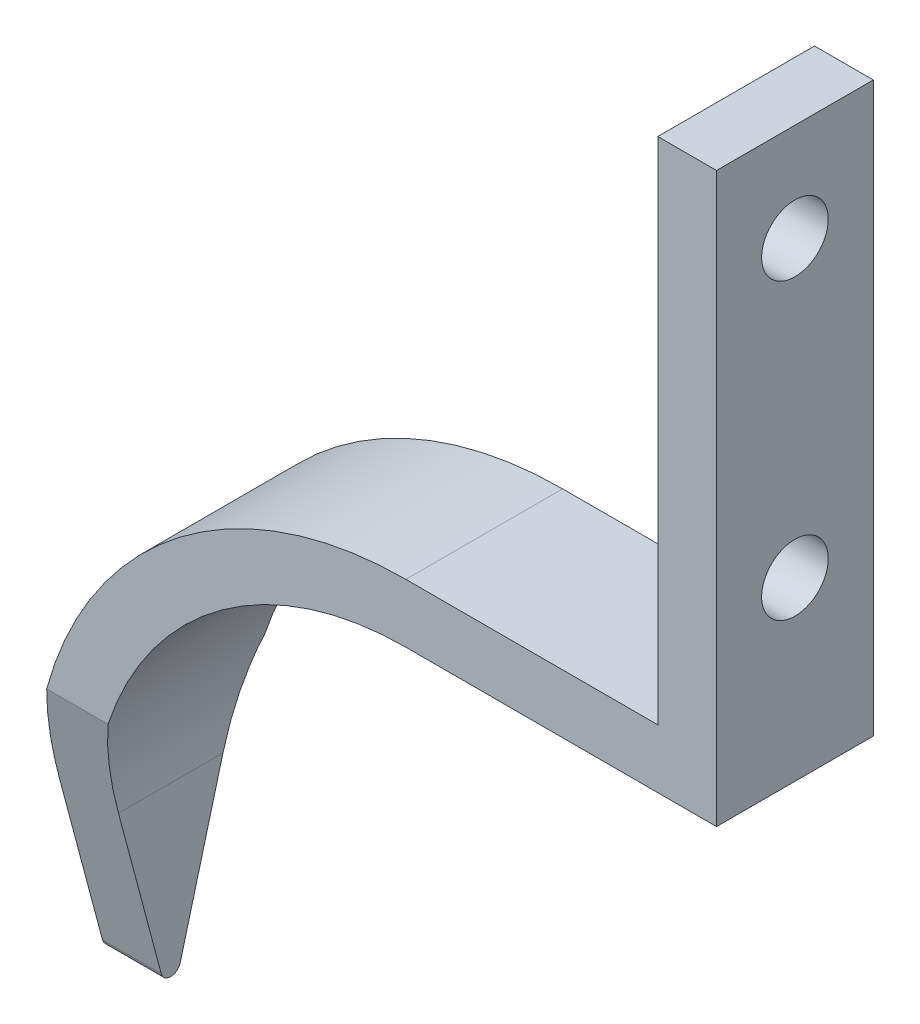
ISO-10303-21;
HEADER;
FILE_DESCRIPTION(('STEP AP214'),'2;1');
FILE_NAME('part.step','',(''),(''),'','','');
FILE_SCHEMA(('AUTOMOTIVE_DESIGN { 1 0 10303 214 1 1 1 1 }'));
ENDSEC;
DATA;
#1=APPLICATION_CONTEXT('core data for automotive mechanical design processes');
#2=APPLICATION_PROTOCOL_DEFINITION('international standard','automotive_design',2000,#1);
#3=PRODUCT_CONTEXT('',#1,'mechanical');
#4=PRODUCT('Part','Part','',(#3));
#5=PRODUCT_RELATED_PRODUCT_CATEGORY('part','',(#4));
#6=PRODUCT_DEFINITION_FORMATION('','',#4);
#7=PRODUCT_DEFINITION_CONTEXT('part definition',#1,'design');
#8=PRODUCT_DEFINITION('design','',#6,#7);
#9=PRODUCT_DEFINITION_SHAPE('','',#8);
#10=(LENGTH_UNIT() NAMED_UNIT(*) SI_UNIT(.MILLI.,.METRE.));
#11=(NAMED_UNIT(*) PLANE_ANGLE_UNIT() SI_UNIT($,.RADIAN.));
#12=(NAMED_UNIT(*) SI_UNIT($,.STERADIAN.) SOLID_ANGLE_UNIT());
#13=UNCERTAINTY_MEASURE_WITH_UNIT(LENGTH_MEASURE(1.E-05),#10,'distance_accuracy_value','');
#14=(GEOMETRIC_REPRESENTATION_CONTEXT(3) GLOBAL_UNCERTAINTY_ASSIGNED_CONTEXT((#13)) GLOBAL_UNIT_ASSIGNED_CONTEXT((#10,
#11,#12)) REPRESENTATION_CONTEXT('',''));
#15=CARTESIAN_POINT('',(0.,0.,0.));
#16=DIRECTION('',(0.,0.,1.));
#17=DIRECTION('',(1.,0.,0.));
#18=AXIS2_PLACEMENT_3D('',#15,#16,#17);
#19=CARTESIAN_POINT('',(-59.,0.,4.00000000000001));
#20=DIRECTION('',(1.,0.,0.));
#21=DIRECTION('',(0.,0.,1.));
#22=AXIS2_PLACEMENT_3D('',#19,#20,#21);
#23=PLANE('',#22);
#24=DIRECTION('',(0.,0.966234939601246,0.257662650560332));
#25=VECTOR('',#24,1.);
#26=CARTESIAN_POINT('',(-59.,2.98755186721991,-11.2033195020747));
#27=LINE('',#26,#25);
#28=CARTESIAN_POINT('',(-59.,46.8116905117523,0.483117469800625));
#29=VERTEX_POINT('',#28);
#30=CARTESIAN_POINT('',(-59.,55.,2.66666666666667));
#31=VERTEX_POINT('',#30);
#32=EDGE_CURVE('E145',#29,#31,#27,.T.);
#33=ORIENTED_EDGE('',*,*,#32,.T.);
#34=DIRECTION('',(0.,0.,-1.));
#35=VECTOR('',#34,1.);
#36=CARTESIAN_POINT('',(-59.,55.,4.));
#37=LINE('',#36,#35);
#38=CARTESIAN_POINT('',(-59.,55.,-2.66666666666666));
#39=VERTEX_POINT('',#38);
#40=EDGE_CURVE('E140',#31,#39,#37,.T.);
#41=ORIENTED_EDGE('',*,*,#40,.T.);
#42=DIRECTION('',(0.,-0.966234939601246,0.257662650560332));
#43=VECTOR('',#42,1.);
#44=CARTESIAN_POINT('',(-59.,2.98755186721991,11.2033195020747));
#45=LINE('',#44,#43);
#46=CARTESIAN_POINT('',(-59.,46.8116905117523,-0.48311746980061));
#47=VERTEX_POINT('',#46);
#48=EDGE_CURVE('E149',#39,#47,#45,.T.);
#49=ORIENTED_EDGE('',*,*,#48,.T.);
#50=CARTESIAN_POINT('',(-59.,46.9405218370325,0.));
#51=DIRECTION('',(-1.,0.,0.));
#52=DIRECTION('',(0.,0.,1.));
#53=AXIS2_PLACEMENT_3D('',#50,#51,#52);
#54=CIRCLE('',#53,0.5);
#55=EDGE_CURVE('E169',#29,#47,#54,.F.);
#56=ORIENTED_EDGE('',*,*,#55,.F.);
#57=EDGE_LOOP('',(#33,#41,#49,#56));
#58=FACE_BOUND('',#57,.T.);
#59=ADVANCED_FACE('F43',(#58),#23,.F.);
#60=CARTESIAN_POINT('',(-40.,55.,4.));
#61=DIRECTION('',(0.,0.,-1.));
#62=DIRECTION('',(1.,0.,0.));
#63=AXIS2_PLACEMENT_3D('',#60,#61,#62);
#64=CYLINDRICAL_SURFACE('',#63,19.);
#65=ORIENTED_EDGE('',*,*,#40,.F.);
#66=CARTESIAN_POINT('',(-40.,55.,2.66666666666667));
#67=DIRECTION('',(0.,-0.257662650560332,0.966234939601246));
#68=DIRECTION('',(0.,-0.966234939601247,-0.257662650560332));
#69=AXIS2_PLACEMENT_3D('',#66,#67,#68);
#70=ELLIPSE('',#69,19.6639546152627,19.);
#71=CARTESIAN_POINT('',(-58.3303027798234,60.,4.));
#72=VERTEX_POINT('',#71);
#73=EDGE_CURVE('E187',#72,#31,#70,.T.);
#74=ORIENTED_EDGE('',*,*,#73,.F.);
#75=CARTESIAN_POINT('',(-40.,55.,4.));
#76=DIRECTION('',(0.,0.,-1.));
#77=DIRECTION('',(-1.,0.,0.));
#78=AXIS2_PLACEMENT_3D('',#75,#76,#77);
#79=CIRCLE('',#78,19.);
#80=CARTESIAN_POINT('',(-40.,74.,4.));
#81=VERTEX_POINT('',#80);
#82=EDGE_CURVE('E216',#72,#81,#79,.T.);
#83=ORIENTED_EDGE('',*,*,#82,.T.);
#84=DIRECTION('',(0.,0.,-1.));
#85=VECTOR('',#84,1.);
#86=CARTESIAN_POINT('',(-40.,74.,4.));
#87=LINE('',#86,#85);
#88=CARTESIAN_POINT('',(-40.,74.,-4.));
#89=VERTEX_POINT('',#88);
#90=EDGE_CURVE('E158',#81,#89,#87,.T.);
#91=ORIENTED_EDGE('',*,*,#90,.T.);
#92=CARTESIAN_POINT('',(-40.,55.,-4.));
#93=DIRECTION('',(0.,0.,-1.));
#94=DIRECTION('',(-1.,0.,0.));
#95=AXIS2_PLACEMENT_3D('',#92,#93,#94);
#96=CIRCLE('',#95,19.);
#97=CARTESIAN_POINT('',(-58.3303027798234,60.,-4.));
#98=VERTEX_POINT('',#97);
#99=EDGE_CURVE('E144',#98,#89,#96,.T.);
#100=ORIENTED_EDGE('',*,*,#99,.F.);
#101=CARTESIAN_POINT('',(-40.,55.,-2.66666666666666));
#102=DIRECTION('',(0.,-0.257662650560332,-0.966234939601246));
#103=DIRECTION('',(0.,0.966234939601247,-0.257662650560332));
#104=AXIS2_PLACEMENT_3D('',#101,#102,#103);
#105=ELLIPSE('',#104,19.6639546152627,19.);
#106=EDGE_CURVE('E136',#39,#98,#105,.T.);
#107=ORIENTED_EDGE('',*,*,#106,.F.);
#108=EDGE_LOOP('',(#65,#74,#83,#91,#100,#107));
#109=FACE_BOUND('',#108,.T.);
#110=ADVANCED_FACE('F137',(#109),#64,.T.);
#111=CARTESIAN_POINT('',(0.,74.,4.));
#112=DIRECTION('',(0.,-1.,0.));
#113=DIRECTION('',(1.,0.,0.));
#114=AXIS2_PLACEMENT_3D('',#111,#112,#113);
#115=PLANE('',#114);
#116=DIRECTION('',(1.,0.,0.));
#117=VECTOR('',#116,1.);
#118=CARTESIAN_POINT('',(0.,74.,-4.));
#119=LINE('',#118,#117);
#120=CARTESIAN_POINT('',(-27.145,74.,-4.));
#121=VERTEX_POINT('',#120);
#122=EDGE_CURVE('E200',#89,#121,#119,.T.);
#123=ORIENTED_EDGE('',*,*,#122,.F.);
#124=ORIENTED_EDGE('',*,*,#90,.F.);
#125=DIRECTION('',(1.,0.,0.));
#126=VECTOR('',#125,1.);
#127=CARTESIAN_POINT('',(0.,74.,4.));
#128=LINE('',#127,#126);
#129=CARTESIAN_POINT('',(-27.145,74.,4.));
#130=VERTEX_POINT('',#129);
#131=EDGE_CURVE('E234',#81,#130,#128,.T.);
#132=ORIENTED_EDGE('',*,*,#131,.T.);
#133=DIRECTION('',(0.,0.,-1.));
#134=VECTOR('',#133,1.);
#135=CARTESIAN_POINT('',(-27.145,74.,4.));
#136=LINE('',#135,#134);
#137=EDGE_CURVE('E163',#130,#121,#136,.T.);
#138=ORIENTED_EDGE('',*,*,#137,.T.);
#139=EDGE_LOOP('',(#123,#124,#132,#138));
#140=FACE_BOUND('',#139,.T.);
#141=ADVANCED_FACE('F232',(#140),#115,.F.);
#142=CARTESIAN_POINT('',(-27.145,0.,4.));
#143=DIRECTION('',(1.,0.,0.));
#144=DIRECTION('',(0.,1.,0.));
#145=AXIS2_PLACEMENT_3D('',#142,#143,#144);
#146=PLANE('',#145);
#147=CARTESIAN_POINT('',(-27.145,80.,0.));
#148=DIRECTION('',(1.,0.,0.));
#149=DIRECTION('',(0.,0.,-1.));
#150=AXIS2_PLACEMENT_3D('',#147,#148,#149);
#151=CIRCLE('',#150,1.70000000000001);
#152=CARTESIAN_POINT('',(-27.145,80.,-1.70000000000001));
#153=VERTEX_POINT('',#152);
#154=EDGE_CURVE('E401',#153,#153,#151,.T.);
#155=ORIENTED_EDGE('',*,*,#154,.T.);
#156=EDGE_LOOP('',(#155));
#157=FACE_BOUND('',#156,.T.);
#158=CARTESIAN_POINT('',(-27.145,95.,0.));
#159=DIRECTION('',(1.,0.,0.));
#160=DIRECTION('',(0.,0.,-1.));
#161=AXIS2_PLACEMENT_3D('',#158,#159,#160);
#162=CIRCLE('',#161,1.70000000000001);
#163=CARTESIAN_POINT('',(-27.145,95.,-1.70000000000001));
#164=VERTEX_POINT('',#163);
#165=EDGE_CURVE('E402',#164,#164,#162,.T.);
#166=ORIENTED_EDGE('',*,*,#165,.T.);
#167=EDGE_LOOP('',(#166));
#168=FACE_BOUND('',#167,.T.);
#169=DIRECTION('',(0.,1.,0.));
#170=VECTOR('',#169,1.);
#171=CARTESIAN_POINT('',(-27.145,0.,-4.));
#172=LINE('',#171,#170);
#173=CARTESIAN_POINT('',(-27.145,100.,-4.));
#174=VERTEX_POINT('',#173);
#175=EDGE_CURVE('E203',#121,#174,#172,.T.);
#176=ORIENTED_EDGE('',*,*,#175,.F.);
#177=ORIENTED_EDGE('',*,*,#137,.F.);
#178=DIRECTION('',(0.,1.,0.));
#179=VECTOR('',#178,1.);
#180=CARTESIAN_POINT('',(-27.145,0.,4.));
#181=LINE('',#180,#179);
#182=CARTESIAN_POINT('',(-27.145,100.,4.));
#183=VERTEX_POINT('',#182);
#184=EDGE_CURVE('E243',#130,#183,#181,.T.);
#185=ORIENTED_EDGE('',*,*,#184,.T.);
#186=DIRECTION('',(0.,0.,-1.));
#187=VECTOR('',#186,1.);
#188=CARTESIAN_POINT('',(-27.145,100.,4.));
#189=LINE('',#188,#187);
#190=EDGE_CURVE('E226',#183,#174,#189,.T.);
#191=ORIENTED_EDGE('',*,*,#190,.T.);
#192=EDGE_LOOP('',(#176,#177,#185,#191));
#193=FACE_BOUND('',#192,.T.);
#194=ADVANCED_FACE('F262',(#157,#168,#193),#146,.F.);
#195=CARTESIAN_POINT('',(0.,100.,4.));
#196=DIRECTION('',(0.,-1.,0.));
#197=DIRECTION('',(0.,0.,1.));
#198=AXIS2_PLACEMENT_3D('',#195,#196,#197);
#199=PLANE('',#198);
#200=DIRECTION('',(1.,0.,0.));
#201=VECTOR('',#200,1.);
#202=CARTESIAN_POINT('',(0.,100.,-4.));
#203=LINE('',#202,#201);
#204=CARTESIAN_POINT('',(-24.145,100.,-4.));
#205=VERTEX_POINT('',#204);
#206=EDGE_CURVE('E206',#174,#205,#203,.T.);
#207=ORIENTED_EDGE('',*,*,#206,.F.);
#208=ORIENTED_EDGE('',*,*,#190,.F.);
#209=DIRECTION('',(1.,0.,0.));
#210=VECTOR('',#209,1.);
#211=CARTESIAN_POINT('',(0.,100.,4.));
#212=LINE('',#211,#210);
#213=CARTESIAN_POINT('',(-24.145,100.,4.));
#214=VERTEX_POINT('',#213);
#215=EDGE_CURVE('E248',#183,#214,#212,.T.);
#216=ORIENTED_EDGE('',*,*,#215,.T.);
#217=DIRECTION('',(0.,0.,-1.));
#218=VECTOR('',#217,1.);
#219=CARTESIAN_POINT('',(-24.145,100.,4.));
#220=LINE('',#219,#218);
#221=EDGE_CURVE('E223',#214,#205,#220,.T.);
#222=ORIENTED_EDGE('',*,*,#221,.T.);
#223=EDGE_LOOP('',(#207,#208,#216,#222));
#224=FACE_BOUND('',#223,.T.);
#225=ADVANCED_FACE('F261',(#224),#199,.F.);
#226=CARTESIAN_POINT('',(-24.145,0.,4.));
#227=DIRECTION('',(-1.,0.,0.));
#228=DIRECTION('',(0.,0.,-1.));
#229=AXIS2_PLACEMENT_3D('',#226,#227,#228);
#230=PLANE('',#229);
#231=CARTESIAN_POINT('',(-24.145,80.,0.));
#232=DIRECTION('',(1.,0.,0.));
#233=DIRECTION('',(0.,0.,-1.));
#234=AXIS2_PLACEMENT_3D('',#231,#232,#233);
#235=CIRCLE('',#234,1.70000000000001);
#236=CARTESIAN_POINT('',(-24.145,80.,-1.70000000000001));
#237=VERTEX_POINT('',#236);
#238=EDGE_CURVE('E154',#237,#237,#235,.T.);
#239=ORIENTED_EDGE('',*,*,#238,.F.);
#240=EDGE_LOOP('',(#239));
#241=FACE_BOUND('',#240,.T.);
#242=CARTESIAN_POINT('',(-24.145,95.,0.));
#243=DIRECTION('',(1.,0.,0.));
#244=DIRECTION('',(0.,0.,-1.));
#245=AXIS2_PLACEMENT_3D('',#242,#243,#244);
#246=CIRCLE('',#245,1.70000000000001);
#247=CARTESIAN_POINT('',(-24.145,95.,-1.70000000000001));
#248=VERTEX_POINT('',#247);
#249=EDGE_CURVE('E406',#248,#248,#246,.T.);
#250=ORIENTED_EDGE('',*,*,#249,.F.);
#251=EDGE_LOOP('',(#250));
#252=FACE_BOUND('',#251,.T.);
#253=DIRECTION('',(0.,-1.,0.));
#254=VECTOR('',#253,1.);
#255=CARTESIAN_POINT('',(-24.145,0.,-4.));
#256=LINE('',#255,#254);
#257=CARTESIAN_POINT('',(-24.145,71.,-4.));
#258=VERTEX_POINT('',#257);
#259=EDGE_CURVE('E209',#205,#258,#256,.T.);
#260=ORIENTED_EDGE('',*,*,#259,.F.);
#261=ORIENTED_EDGE('',*,*,#221,.F.);
#262=DIRECTION('',(0.,-1.,0.));
#263=VECTOR('',#262,1.);
#264=CARTESIAN_POINT('',(-24.145,0.,4.));
#265=LINE('',#264,#263);
#266=CARTESIAN_POINT('',(-24.145,71.,4.));
#267=VERTEX_POINT('',#266);
#268=EDGE_CURVE('E195',#214,#267,#265,.T.);
#269=ORIENTED_EDGE('',*,*,#268,.T.);
#270=DIRECTION('',(0.,0.,-1.));
#271=VECTOR('',#270,1.);
#272=CARTESIAN_POINT('',(-24.145,71.,4.));
#273=LINE('',#272,#271);
#274=EDGE_CURVE('E220',#267,#258,#273,.T.);
#275=ORIENTED_EDGE('',*,*,#274,.T.);
#276=EDGE_LOOP('',(#260,#261,#269,#275));
#277=FACE_BOUND('',#276,.T.);
#278=ADVANCED_FACE('F253',(#241,#252,#277),#230,.F.);
#279=CARTESIAN_POINT('',(0.,71.,4.));
#280=DIRECTION('',(0.,1.,0.));
#281=DIRECTION('',(0.,0.,-1.));
#282=AXIS2_PLACEMENT_3D('',#279,#280,#281);
#283=PLANE('',#282);
#284=DIRECTION('',(-1.,0.,0.));
#285=VECTOR('',#284,1.);
#286=CARTESIAN_POINT('',(0.,71.,-4.));
#287=LINE('',#286,#285);
#288=CARTESIAN_POINT('',(-40.,71.,-4.));
#289=VERTEX_POINT('',#288);
#290=EDGE_CURVE('E212',#258,#289,#287,.T.);
#291=ORIENTED_EDGE('',*,*,#290,.F.);
#292=ORIENTED_EDGE('',*,*,#274,.F.);
#293=DIRECTION('',(-1.,0.,0.));
#294=VECTOR('',#293,1.);
#295=CARTESIAN_POINT('',(0.,71.,4.));
#296=LINE('',#295,#294);
#297=CARTESIAN_POINT('',(-40.,71.,4.));
#298=VERTEX_POINT('',#297);
#299=EDGE_CURVE('E189',#267,#298,#296,.T.);
#300=ORIENTED_EDGE('',*,*,#299,.T.);
#301=DIRECTION('',(0.,0.,-1.));
#302=VECTOR('',#301,1.);
#303=CARTESIAN_POINT('',(-40.,71.,4.));
#304=LINE('',#303,#302);
#305=EDGE_CURVE('E181',#298,#289,#304,.T.);
#306=ORIENTED_EDGE('',*,*,#305,.T.);
#307=EDGE_LOOP('',(#291,#292,#300,#306));
#308=FACE_BOUND('',#307,.T.);
#309=ADVANCED_FACE('F258',(#308),#283,.F.);
#310=CARTESIAN_POINT('',(-40.,55.,4.));
#311=DIRECTION('',(0.,0.,-1.));
#312=DIRECTION('',(1.,0.,0.));
#313=AXIS2_PLACEMENT_3D('',#310,#311,#312);
#314=CYLINDRICAL_SURFACE('',#313,16.);
#315=CARTESIAN_POINT('',(-40.,55.,-2.66666666666666));
#316=DIRECTION('',(0.,-0.257662650560332,-0.966234939601246));
#317=DIRECTION('',(0.,0.966234939601247,-0.257662650560332));
#318=AXIS2_PLACEMENT_3D('',#315,#316,#317);
#319=ELLIPSE('',#318,16.5591196760107,16.);
#320=CARTESIAN_POINT('',(-56.,55.,-2.66666666666666));
#321=VERTEX_POINT('',#320);
#322=CARTESIAN_POINT('',(-55.1986841535707,60.,-4.));
#323=VERTEX_POINT('',#322);
#324=EDGE_CURVE('E146',#321,#323,#319,.T.);
#325=ORIENTED_EDGE('',*,*,#324,.T.);
#326=CARTESIAN_POINT('',(-40.,55.,-4.));
#327=DIRECTION('',(0.,0.,-1.));
#328=DIRECTION('',(-1.,0.,0.));
#329=AXIS2_PLACEMENT_3D('',#326,#327,#328);
#330=CIRCLE('',#329,16.);
#331=EDGE_CURVE('E215',#323,#289,#330,.T.);
#332=ORIENTED_EDGE('',*,*,#331,.T.);
#333=ORIENTED_EDGE('',*,*,#305,.F.);
#334=CARTESIAN_POINT('',(-40.,55.,4.));
#335=DIRECTION('',(0.,0.,-1.));
#336=DIRECTION('',(-1.,0.,0.));
#337=AXIS2_PLACEMENT_3D('',#334,#335,#336);
#338=CIRCLE('',#337,16.);
#339=CARTESIAN_POINT('',(-55.1986841535707,60.,4.));
#340=VERTEX_POINT('',#339);
#341=EDGE_CURVE('E182',#340,#298,#338,.T.);
#342=ORIENTED_EDGE('',*,*,#341,.F.);
#343=CARTESIAN_POINT('',(-40.,55.,2.66666666666667));
#344=DIRECTION('',(0.,-0.257662650560332,0.966234939601246));
#345=DIRECTION('',(0.,-0.966234939601247,-0.257662650560332));
#346=AXIS2_PLACEMENT_3D('',#343,#344,#345);
#347=ELLIPSE('',#346,16.5591196760107,16.);
#348=CARTESIAN_POINT('',(-56.,55.,2.66666666666668));
#349=VERTEX_POINT('',#348);
#350=EDGE_CURVE('E177',#340,#349,#347,.T.);
#351=ORIENTED_EDGE('',*,*,#350,.T.);
#352=DIRECTION('',(0.,0.,-1.));
#353=VECTOR('',#352,1.);
#354=CARTESIAN_POINT('',(-56.,55.,4.));
#355=LINE('',#354,#353);
#356=EDGE_CURVE('E179',#349,#321,#355,.T.);
#357=ORIENTED_EDGE('',*,*,#356,.T.);
#358=EDGE_LOOP('',(#325,#332,#333,#342,#351,#357));
#359=FACE_BOUND('',#358,.T.);
#360=ADVANCED_FACE('F313',(#359),#314,.F.);
#361=CARTESIAN_POINT('',(-56.,0.,4.00000000000001));
#362=DIRECTION('',(-1.,0.,0.));
#363=DIRECTION('',(0.,-1.,0.));
#364=AXIS2_PLACEMENT_3D('',#361,#362,#363);
#365=PLANE('',#364);
#366=DIRECTION('',(0.,-0.966234939601247,0.257662650560332));
#367=VECTOR('',#366,1.);
#368=CARTESIAN_POINT('',(-56.,1.99170124481324,11.4688796680498));
#369=LINE('',#368,#367);
#370=CARTESIAN_POINT('',(-56.,46.8116905117523,-0.48311746980062));
#371=VERTEX_POINT('',#370);
#372=EDGE_CURVE('E172',#321,#371,#369,.T.);
#373=ORIENTED_EDGE('',*,*,#372,.F.);
#374=ORIENTED_EDGE('',*,*,#356,.F.);
#375=DIRECTION('',(0.,0.966234939601247,0.257662650560332));
#376=VECTOR('',#375,1.);
#377=CARTESIAN_POINT('',(-56.,3.98340248962651,-10.9377593360996));
#378=LINE('',#377,#376);
#379=CARTESIAN_POINT('',(-56.,46.8116905117523,0.483117469800636));
#380=VERTEX_POINT('',#379);
#381=EDGE_CURVE('E175',#380,#349,#378,.T.);
#382=ORIENTED_EDGE('',*,*,#381,.F.);
#383=CARTESIAN_POINT('',(-56.,46.9405218370325,0.));
#384=DIRECTION('',(1.,0.,0.));
#385=DIRECTION('',(0.,-1.,0.));
#386=AXIS2_PLACEMENT_3D('',#383,#384,#385);
#387=CIRCLE('',#386,0.5);
#388=EDGE_CURVE('E11',#371,#380,#387,.F.);
#389=ORIENTED_EDGE('',*,*,#388,.F.);
#390=EDGE_LOOP('',(#373,#374,#382,#389));
#391=FACE_BOUND('',#390,.T.);
#392=ADVANCED_FACE('F322',(#391),#365,.F.);
#393=CARTESIAN_POINT('',(0.,0.,4.));
#394=DIRECTION('',(0.,0.,1.));
#395=DIRECTION('',(-1.,0.,0.));
#396=AXIS2_PLACEMENT_3D('',#393,#394,#395);
#397=PLANE('',#396);
#398=DIRECTION('',(1.,0.,0.));
#399=VECTOR('',#398,1.);
#400=CARTESIAN_POINT('',(0.,60.,4.));
#401=LINE('',#400,#399);
#402=EDGE_CURVE('E157',#72,#340,#401,.T.);
#403=ORIENTED_EDGE('',*,*,#402,.T.);
#404=ORIENTED_EDGE('',*,*,#341,.T.);
#405=ORIENTED_EDGE('',*,*,#299,.F.);
#406=ORIENTED_EDGE('',*,*,#268,.F.);
#407=ORIENTED_EDGE('',*,*,#215,.F.);
#408=ORIENTED_EDGE('',*,*,#184,.F.);
#409=ORIENTED_EDGE('',*,*,#131,.F.);
#410=ORIENTED_EDGE('',*,*,#82,.F.);
#411=EDGE_LOOP('',(#403,#404,#405,#406,#407,#408,#409,#410));
#412=FACE_BOUND('',#411,.T.);
#413=ADVANCED_FACE('F255',(#412),#397,.T.);
#414=CARTESIAN_POINT('',(0.,0.,-4.));
#415=DIRECTION('',(0.,0.,1.));
#416=DIRECTION('',(-1.,0.,0.));
#417=AXIS2_PLACEMENT_3D('',#414,#415,#416);
#418=PLANE('',#417);
#419=ORIENTED_EDGE('',*,*,#99,.T.);
#420=ORIENTED_EDGE('',*,*,#122,.T.);
#421=ORIENTED_EDGE('',*,*,#175,.T.);
#422=ORIENTED_EDGE('',*,*,#206,.T.);
#423=ORIENTED_EDGE('',*,*,#259,.T.);
#424=ORIENTED_EDGE('',*,*,#290,.T.);
#425=ORIENTED_EDGE('',*,*,#331,.F.);
#426=DIRECTION('',(-1.,0.,0.));
#427=VECTOR('',#426,1.);
#428=CARTESIAN_POINT('',(-24.145,60.,-4.));
#429=LINE('',#428,#427);
#430=EDGE_CURVE('E153',#323,#98,#429,.T.);
#431=ORIENTED_EDGE('',*,*,#430,.T.);
#432=EDGE_LOOP('',(#419,#420,#421,#422,#423,#424,#425,#431));
#433=FACE_BOUND('',#432,.T.);
#434=ADVANCED_FACE('F238',(#433),#418,.F.);
#435=CARTESIAN_POINT('',(-24.145,2.98755186721991,-11.2033195020747));
#436=DIRECTION('',(0.,0.257662650560332,-0.966234939601246));
#437=DIRECTION('',(0.,-0.966234939601247,-0.257662650560332));
#438=AXIS2_PLACEMENT_3D('',#435,#436,#437);
#439=PLANE('',#438);
#440=ORIENTED_EDGE('',*,*,#381,.T.);
#441=ORIENTED_EDGE('',*,*,#350,.F.);
#442=ORIENTED_EDGE('',*,*,#402,.F.);
#443=ORIENTED_EDGE('',*,*,#73,.T.);
#444=ORIENTED_EDGE('',*,*,#32,.F.);
#445=DIRECTION('',(-1.,0.,0.));
#446=VECTOR('',#445,1.);
#447=CARTESIAN_POINT('',(-24.145,46.8116905117523,0.483117469800625));
#448=LINE('',#447,#446);
#449=EDGE_CURVE('E161',#380,#29,#448,.T.);
#450=ORIENTED_EDGE('',*,*,#449,.F.);
#451=EDGE_LOOP('',(#440,#441,#442,#443,#444,#450));
#452=FACE_BOUND('',#451,.T.);
#453=ADVANCED_FACE('F349',(#452),#439,.F.);
#454=CARTESIAN_POINT('',(-24.145,2.98755186721991,11.2033195020747));
#455=DIRECTION('',(0.,0.257662650560332,0.966234939601246));
#456=DIRECTION('',(0.,0.966234939601247,-0.257662650560332));
#457=AXIS2_PLACEMENT_3D('',#454,#455,#456);
#458=PLANE('',#457);
#459=ORIENTED_EDGE('',*,*,#48,.F.);
#460=ORIENTED_EDGE('',*,*,#106,.T.);
#461=ORIENTED_EDGE('',*,*,#430,.F.);
#462=ORIENTED_EDGE('',*,*,#324,.F.);
#463=ORIENTED_EDGE('',*,*,#372,.T.);
#464=DIRECTION('',(-1.,0.,0.));
#465=VECTOR('',#464,1.);
#466=CARTESIAN_POINT('',(-24.145,46.8116905117523,-0.483117469800618));
#467=LINE('',#466,#465);
#468=EDGE_CURVE('E52',#47,#371,#467,.F.);
#469=ORIENTED_EDGE('',*,*,#468,.F.);
#470=EDGE_LOOP('',(#459,#460,#461,#462,#463,#469));
#471=FACE_BOUND('',#470,.T.);
#472=ADVANCED_FACE('F150',(#471),#458,.F.);
#473=CARTESIAN_POINT('',(-24.145,46.9405218370325,0.));
#474=DIRECTION('',(-1.,0.,0.));
#475=DIRECTION('',(0.,0.,-1.));
#476=AXIS2_PLACEMENT_3D('',#473,#474,#475);
#477=CYLINDRICAL_SURFACE('',#476,0.5);
#478=ORIENTED_EDGE('',*,*,#388,.T.);
#479=ORIENTED_EDGE('',*,*,#449,.T.);
#480=ORIENTED_EDGE('',*,*,#55,.T.);
#481=ORIENTED_EDGE('',*,*,#468,.T.);
#482=EDGE_LOOP('',(#478,#479,#480,#481));
#483=FACE_BOUND('',#482,.T.);
#484=ADVANCED_FACE('F45',(#483),#477,.T.);
#485=CARTESIAN_POINT('',(-24.145,95.,0.));
#486=DIRECTION('',(-1.,0.,0.));
#487=DIRECTION('',(0.,0.,-1.));
#488=AXIS2_PLACEMENT_3D('',#485,#486,#487);
#489=CYLINDRICAL_SURFACE('',#488,1.70000000000001);
#490=CARTESIAN_POINT('',(-24.145,95.,-1.70000000000001));
#491=CARTESIAN_POINT('',(-24.17625,95.,-1.70000000000001));
#492=CARTESIAN_POINT('',(-24.2075,95.,-1.70000000000001));
#493=CARTESIAN_POINT('',(-24.27,95.,-1.70000000000001));
#494=CARTESIAN_POINT('',(-24.30125,95.,-1.70000000000001));
#495=CARTESIAN_POINT('',(-24.36375,95.,-1.70000000000001));
#496=CARTESIAN_POINT('',(-24.395,95.,-1.70000000000001));
#497=CARTESIAN_POINT('',(-24.4575,95.,-1.70000000000001));
#498=CARTESIAN_POINT('',(-24.48875,95.,-1.70000000000001));
#499=CARTESIAN_POINT('',(-24.55125,95.,-1.70000000000001));
#500=CARTESIAN_POINT('',(-24.5825,95.,-1.70000000000001));
#501=CARTESIAN_POINT('',(-24.645,95.,-1.70000000000001));
#502=CARTESIAN_POINT('',(-24.67625,95.,-1.70000000000001));
#503=CARTESIAN_POINT('',(-24.73875,95.,-1.70000000000001));
#504=CARTESIAN_POINT('',(-24.77,95.,-1.70000000000001));
#505=CARTESIAN_POINT('',(-24.8325,95.,-1.70000000000001));
#506=CARTESIAN_POINT('',(-24.86375,95.,-1.70000000000001));
#507=CARTESIAN_POINT('',(-24.92625,95.,-1.70000000000001));
#508=CARTESIAN_POINT('',(-24.9575,95.,-1.70000000000001));
#509=CARTESIAN_POINT('',(-25.02,95.,-1.70000000000001));
#510=CARTESIAN_POINT('',(-25.05125,95.,-1.70000000000001));
#511=CARTESIAN_POINT('',(-25.11375,95.,-1.70000000000001));
#512=CARTESIAN_POINT('',(-25.145,95.,-1.70000000000001));
#513=CARTESIAN_POINT('',(-25.2075,95.,-1.70000000000001));
#514=CARTESIAN_POINT('',(-25.23875,95.,-1.70000000000001));
#515=CARTESIAN_POINT('',(-25.30125,95.,-1.70000000000001));
#516=CARTESIAN_POINT('',(-25.3325,95.,-1.70000000000001));
#517=CARTESIAN_POINT('',(-25.395,95.,-1.70000000000001));
#518=CARTESIAN_POINT('',(-25.42625,95.,-1.70000000000001));
#519=CARTESIAN_POINT('',(-25.48875,95.,-1.70000000000001));
#520=CARTESIAN_POINT('',(-25.52,95.,-1.70000000000001));
#521=CARTESIAN_POINT('',(-25.5825,95.,-1.70000000000001));
#522=CARTESIAN_POINT('',(-25.61375,95.,-1.70000000000001));
#523=CARTESIAN_POINT('',(-25.67625,95.,-1.70000000000001));
#524=CARTESIAN_POINT('',(-25.7075,95.,-1.70000000000001));
#525=CARTESIAN_POINT('',(-25.77,95.,-1.70000000000001));
#526=CARTESIAN_POINT('',(-25.80125,95.,-1.70000000000001));
#527=CARTESIAN_POINT('',(-25.86375,95.,-1.70000000000001));
#528=CARTESIAN_POINT('',(-25.895,95.,-1.70000000000001));
#529=CARTESIAN_POINT('',(-25.9575,95.,-1.70000000000001));
#530=CARTESIAN_POINT('',(-25.98875,95.,-1.70000000000001));
#531=CARTESIAN_POINT('',(-26.05125,95.,-1.70000000000001));
#532=CARTESIAN_POINT('',(-26.0825,95.,-1.70000000000001));
#533=CARTESIAN_POINT('',(-26.145,95.,-1.70000000000001));
#534=CARTESIAN_POINT('',(-26.17625,95.,-1.70000000000001));
#535=CARTESIAN_POINT('',(-26.23875,95.,-1.70000000000001));
#536=CARTESIAN_POINT('',(-26.27,95.,-1.70000000000001));
#537=CARTESIAN_POINT('',(-26.3325,95.,-1.70000000000001));
#538=CARTESIAN_POINT('',(-26.36375,95.,-1.70000000000001));
#539=CARTESIAN_POINT('',(-26.42625,95.,-1.70000000000001));
#540=CARTESIAN_POINT('',(-26.4575,95.,-1.70000000000001));
#541=CARTESIAN_POINT('',(-26.52,95.,-1.70000000000001));
#542=CARTESIAN_POINT('',(-26.55125,95.,-1.70000000000001));
#543=CARTESIAN_POINT('',(-26.61375,95.,-1.70000000000001));
#544=CARTESIAN_POINT('',(-26.645,95.,-1.70000000000001));
#545=CARTESIAN_POINT('',(-26.7075,95.,-1.70000000000001));
#546=CARTESIAN_POINT('',(-26.73875,95.,-1.70000000000001));
#547=CARTESIAN_POINT('',(-26.80125,95.,-1.70000000000001));
#548=CARTESIAN_POINT('',(-26.8325,95.,-1.70000000000001));
#549=CARTESIAN_POINT('',(-26.895,95.,-1.70000000000001));
#550=CARTESIAN_POINT('',(-26.92625,95.,-1.70000000000001));
#551=CARTESIAN_POINT('',(-26.98875,95.,-1.70000000000001));
#552=CARTESIAN_POINT('',(-27.02,95.,-1.70000000000001));
#553=CARTESIAN_POINT('',(-27.0825,95.,-1.70000000000001));
#554=CARTESIAN_POINT('',(-27.11375,95.,-1.70000000000001));
#555=CARTESIAN_POINT('',(-27.145,95.,-1.70000000000001));
#556=B_SPLINE_CURVE_WITH_KNOTS('',3,(#490,#491,#492,#493,#494,#495,#496,#497,#498,#499,#500,
#501,#502,#503,#504,#505,#506,#507,#508,#509,#510,#511,#512,#513,#514,#515,#516,#517,#518,#519,
#520,#521,#522,#523,#524,#525,#526,#527,#528,#529,#530,#531,#532,#533,#534,#535,#536,#537,#538,
#539,#540,#541,#542,#543,#544,#545,#546,#547,#548,#549,#550,#551,#552,#553,#554,#555),
.UNSPECIFIED.,.F.,.F.,(4,2,2,2,2,2,2,2,2,2,2,2,2,2,2,2,2,2,2,2,2,2,2,2,2,2,2,2,2,2,2,2,4),(0.,
0.0937500000000001,0.1875,0.28125,0.375,0.46875,0.5625,0.656250000000001,0.750000000000001,
0.843749999999997,0.937499999999997,1.03125,1.125,1.21875,1.3125,1.40625,1.5,1.59374999999999,
1.68749999999999,1.78124999999999,1.87499999999999,1.96874999999999,2.06249999999999,2.15625,
2.25,2.34374999999999,2.43749999999999,2.53124999999999,2.62499999999999,2.71874999999999,
2.81249999999999,2.90624999999999,2.99999999999999),.UNSPECIFIED.);
#557=EDGE_CURVE('BSEAM375',#248,#164,#556,.T.);
#558=ORIENTED_EDGE('',*,*,#249,.T.);
#559=ORIENTED_EDGE('',*,*,#165,.F.);
#560=ORIENTED_EDGE('',*,*,#557,.T.);
#561=ORIENTED_EDGE('',*,*,#557,.F.);
#562=EDGE_LOOP('',(#558,#560,#559,#561));
#563=FACE_BOUND('',#562,.T.);
#564=ADVANCED_FACE('F375',(#563),#489,.F.);
#565=CARTESIAN_POINT('',(-24.145,80.,0.));
#566=DIRECTION('',(-1.,0.,0.));
#567=DIRECTION('',(0.,0.,-1.));
#568=AXIS2_PLACEMENT_3D('',#565,#566,#567);
#569=CYLINDRICAL_SURFACE('',#568,1.70000000000001);
#570=CARTESIAN_POINT('',(-24.145,80.,-1.70000000000001));
#571=CARTESIAN_POINT('',(-24.17625,80.,-1.70000000000001));
#572=CARTESIAN_POINT('',(-24.2075,80.,-1.70000000000001));
#573=CARTESIAN_POINT('',(-24.27,80.,-1.70000000000001));
#574=CARTESIAN_POINT('',(-24.30125,80.,-1.70000000000001));
#575=CARTESIAN_POINT('',(-24.36375,80.,-1.70000000000001));
#576=CARTESIAN_POINT('',(-24.395,80.,-1.70000000000001));
#577=CARTESIAN_POINT('',(-24.4575,80.,-1.70000000000001));
#578=CARTESIAN_POINT('',(-24.48875,80.,-1.70000000000001));
#579=CARTESIAN_POINT('',(-24.55125,80.,-1.70000000000001));
#580=CARTESIAN_POINT('',(-24.5825,80.,-1.70000000000001));
#581=CARTESIAN_POINT('',(-24.645,80.,-1.70000000000001));
#582=CARTESIAN_POINT('',(-24.67625,80.,-1.70000000000001));
#583=CARTESIAN_POINT('',(-24.73875,80.,-1.70000000000001));
#584=CARTESIAN_POINT('',(-24.77,80.,-1.70000000000001));
#585=CARTESIAN_POINT('',(-24.8325,80.,-1.70000000000001));
#586=CARTESIAN_POINT('',(-24.86375,80.,-1.70000000000001));
#587=CARTESIAN_POINT('',(-24.92625,80.,-1.70000000000001));
#588=CARTESIAN_POINT('',(-24.9575,80.,-1.70000000000001));
#589=CARTESIAN_POINT('',(-25.02,80.,-1.70000000000001));
#590=CARTESIAN_POINT('',(-25.05125,80.,-1.70000000000001));
#591=CARTESIAN_POINT('',(-25.11375,80.,-1.70000000000001));
#592=CARTESIAN_POINT('',(-25.145,80.,-1.70000000000001));
#593=CARTESIAN_POINT('',(-25.2075,80.,-1.70000000000001));
#594=CARTESIAN_POINT('',(-25.23875,80.,-1.70000000000001));
#595=CARTESIAN_POINT('',(-25.30125,80.,-1.70000000000001));
#596=CARTESIAN_POINT('',(-25.3325,80.,-1.70000000000001));
#597=CARTESIAN_POINT('',(-25.395,80.,-1.70000000000001));
#598=CARTESIAN_POINT('',(-25.42625,80.,-1.70000000000001));
#599=CARTESIAN_POINT('',(-25.48875,80.,-1.70000000000001));
#600=CARTESIAN_POINT('',(-25.52,80.,-1.70000000000001));
#601=CARTESIAN_POINT('',(-25.5825,80.,-1.70000000000001));
#602=CARTESIAN_POINT('',(-25.61375,80.,-1.70000000000001));
#603=CARTESIAN_POINT('',(-25.67625,80.,-1.70000000000001));
#604=CARTESIAN_POINT('',(-25.7075,80.,-1.70000000000001));
#605=CARTESIAN_POINT('',(-25.77,80.,-1.70000000000001));
#606=CARTESIAN_POINT('',(-25.80125,80.,-1.70000000000001));
#607=CARTESIAN_POINT('',(-25.86375,80.,-1.70000000000001));
#608=CARTESIAN_POINT('',(-25.895,80.,-1.70000000000001));
#609=CARTESIAN_POINT('',(-25.9575,80.,-1.70000000000001));
#610=CARTESIAN_POINT('',(-25.98875,80.,-1.70000000000001));
#611=CARTESIAN_POINT('',(-26.05125,80.,-1.70000000000001));
#612=CARTESIAN_POINT('',(-26.0825,80.,-1.70000000000001));
#613=CARTESIAN_POINT('',(-26.145,80.,-1.70000000000001));
#614=CARTESIAN_POINT('',(-26.17625,80.,-1.70000000000001));
#615=CARTESIAN_POINT('',(-26.23875,80.,-1.70000000000001));
#616=CARTESIAN_POINT('',(-26.27,80.,-1.70000000000001));
#617=CARTESIAN_POINT('',(-26.3325,80.,-1.70000000000001));
#618=CARTESIAN_POINT('',(-26.36375,80.,-1.70000000000001));
#619=CARTESIAN_POINT('',(-26.42625,80.,-1.70000000000001));
#620=CARTESIAN_POINT('',(-26.4575,80.,-1.70000000000001));
#621=CARTESIAN_POINT('',(-26.52,80.,-1.70000000000001));
#622=CARTESIAN_POINT('',(-26.55125,80.,-1.70000000000001));
#623=CARTESIAN_POINT('',(-26.61375,80.,-1.70000000000001));
#624=CARTESIAN_POINT('',(-26.645,80.,-1.70000000000001));
#625=CARTESIAN_POINT('',(-26.7075,80.,-1.70000000000001));
#626=CARTESIAN_POINT('',(-26.73875,80.,-1.70000000000001));
#627=CARTESIAN_POINT('',(-26.80125,80.,-1.70000000000001));
#628=CARTESIAN_POINT('',(-26.8325,80.,-1.70000000000001));
#629=CARTESIAN_POINT('',(-26.895,80.,-1.70000000000001));
#630=CARTESIAN_POINT('',(-26.92625,80.,-1.70000000000001));
#631=CARTESIAN_POINT('',(-26.98875,80.,-1.70000000000001));
#632=CARTESIAN_POINT('',(-27.02,80.,-1.70000000000001));
#633=CARTESIAN_POINT('',(-27.0825,80.,-1.70000000000001));
#634=CARTESIAN_POINT('',(-27.11375,80.,-1.70000000000001));
#635=CARTESIAN_POINT('',(-27.145,80.,-1.70000000000001));
#636=B_SPLINE_CURVE_WITH_KNOTS('',3,(#570,#571,#572,#573,#574,#575,#576,#577,#578,#579,#580,
#581,#582,#583,#584,#585,#586,#587,#588,#589,#590,#591,#592,#593,#594,#595,#596,#597,#598,#599,
#600,#601,#602,#603,#604,#605,#606,#607,#608,#609,#610,#611,#612,#613,#614,#615,#616,#617,#618,
#619,#620,#621,#622,#623,#624,#625,#626,#627,#628,#629,#630,#631,#632,#633,#634,#635),
.UNSPECIFIED.,.F.,.F.,(4,2,2,2,2,2,2,2,2,2,2,2,2,2,2,2,2,2,2,2,2,2,2,2,2,2,2,2,2,2,2,2,4),(0.,
0.0937500000000001,0.1875,0.28125,0.375,0.46875,0.5625,0.656250000000001,0.750000000000001,
0.843749999999997,0.937499999999997,1.03125,1.125,1.21875,1.3125,1.40625,1.5,1.59374999999999,
1.68749999999999,1.78124999999999,1.87499999999999,1.96874999999999,2.06249999999999,2.15625,
2.25,2.34374999999999,2.43749999999999,2.53124999999999,2.62499999999999,2.71874999999999,
2.81249999999999,2.90624999999999,2.99999999999999),.UNSPECIFIED.);
#637=EDGE_CURVE('BSEAM383',#237,#153,#636,.T.);
#638=ORIENTED_EDGE('',*,*,#238,.T.);
#639=ORIENTED_EDGE('',*,*,#154,.F.);
#640=ORIENTED_EDGE('',*,*,#637,.T.);
#641=ORIENTED_EDGE('',*,*,#637,.F.);
#642=EDGE_LOOP('',(#638,#640,#639,#641));
#643=FACE_BOUND('',#642,.T.);
#644=ADVANCED_FACE('F383',(#643),#569,.F.);
#645=CLOSED_SHELL('',(#59,#110,#141,#194,#225,#278,#309,#360,#392,#413,#434,#453,#472,#484,#564,#644));
#646=MANIFOLD_SOLID_BREP('B2',#645);
#647=ADVANCED_BREP_SHAPE_REPRESENTATION('',(#18,#646),#14);
#648=SHAPE_DEFINITION_REPRESENTATION(#9,#647);
ENDSEC;
END-ISO-10303-21;
